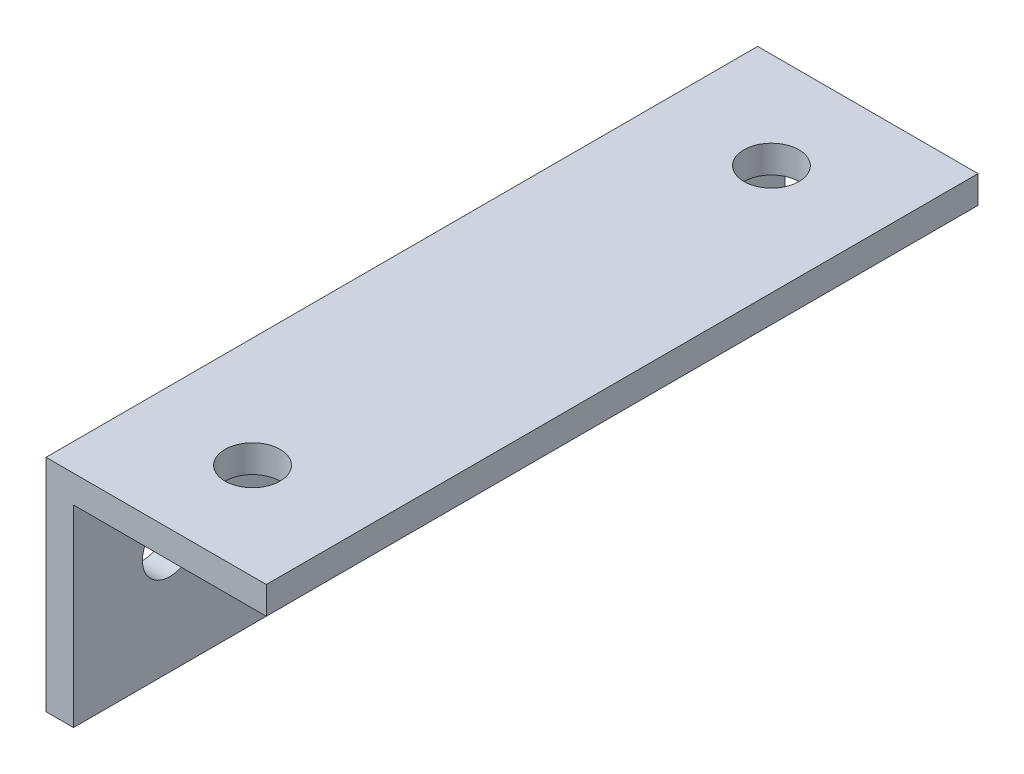
ISO-10303-21;
HEADER;
FILE_DESCRIPTION(('STEP AP214'),'2;1');
FILE_NAME('part.step','',(''),(''),'','','');
FILE_SCHEMA(('AUTOMOTIVE_DESIGN { 1 0 10303 214 1 1 1 1 }'));
ENDSEC;
DATA;
#1=APPLICATION_CONTEXT('core data for automotive mechanical design processes');
#2=APPLICATION_PROTOCOL_DEFINITION('international standard','automotive_design',2000,#1);
#3=PRODUCT_CONTEXT('',#1,'mechanical');
#4=PRODUCT('Part','Part','',(#3));
#5=PRODUCT_RELATED_PRODUCT_CATEGORY('part','',(#4));
#6=PRODUCT_DEFINITION_FORMATION('','',#4);
#7=PRODUCT_DEFINITION_CONTEXT('part definition',#1,'design');
#8=PRODUCT_DEFINITION('design','',#6,#7);
#9=PRODUCT_DEFINITION_SHAPE('','',#8);
#10=(LENGTH_UNIT() NAMED_UNIT(*) SI_UNIT(.MILLI.,.METRE.));
#11=(NAMED_UNIT(*) PLANE_ANGLE_UNIT() SI_UNIT($,.RADIAN.));
#12=(NAMED_UNIT(*) SI_UNIT($,.STERADIAN.) SOLID_ANGLE_UNIT());
#13=UNCERTAINTY_MEASURE_WITH_UNIT(LENGTH_MEASURE(1.E-05),#10,'distance_accuracy_value','');
#14=(GEOMETRIC_REPRESENTATION_CONTEXT(3) GLOBAL_UNCERTAINTY_ASSIGNED_CONTEXT((#13)) GLOBAL_UNIT_ASSIGNED_CONTEXT((#10,
#11,#12)) REPRESENTATION_CONTEXT('',''));
#15=CARTESIAN_POINT('',(0.,0.,0.));
#16=DIRECTION('',(0.,0.,1.));
#17=DIRECTION('',(1.,0.,0.));
#18=AXIS2_PLACEMENT_3D('',#15,#16,#17);
#19=CARTESIAN_POINT('',(3.175,0.,82.042));
#20=DIRECTION('',(0.,1.,0.));
#21=DIRECTION('',(0.,0.,1.));
#22=AXIS2_PLACEMENT_3D('',#19,#20,#21);
#23=PLANE('',#22);
#24=DIRECTION('',(1.,0.,0.));
#25=VECTOR('',#24,1.);
#26=CARTESIAN_POINT('',(3.175,0.,0.));
#27=LINE('',#26,#25);
#28=CARTESIAN_POINT('',(0.,0.,0.));
#29=VERTEX_POINT('',#28);
#30=CARTESIAN_POINT('',(3.175,0.,0.));
#31=VERTEX_POINT('',#30);
#32=EDGE_CURVE('E116',#29,#31,#27,.T.);
#33=ORIENTED_EDGE('',*,*,#32,.T.);
#34=DIRECTION('',(0.,0.,-1.));
#35=VECTOR('',#34,1.);
#36=CARTESIAN_POINT('',(3.175,0.,82.042));
#37=LINE('',#36,#35);
#38=CARTESIAN_POINT('',(3.175,0.,82.042));
#39=VERTEX_POINT('',#38);
#40=EDGE_CURVE('E11',#39,#31,#37,.T.);
#41=ORIENTED_EDGE('',*,*,#40,.F.);
#42=DIRECTION('',(1.,0.,0.));
#43=VECTOR('',#42,1.);
#44=CARTESIAN_POINT('',(3.175,0.,82.042));
#45=LINE('',#44,#43);
#46=CARTESIAN_POINT('',(0.,0.,82.042));
#47=VERTEX_POINT('',#46);
#48=EDGE_CURVE('E127',#47,#39,#45,.T.);
#49=ORIENTED_EDGE('',*,*,#48,.F.);
#50=DIRECTION('',(0.,0.,-1.));
#51=VECTOR('',#50,1.);
#52=CARTESIAN_POINT('',(0.,0.,82.042));
#53=LINE('',#52,#51);
#54=EDGE_CURVE('E112',#47,#29,#53,.T.);
#55=ORIENTED_EDGE('',*,*,#54,.T.);
#56=EDGE_LOOP('',(#33,#41,#49,#55));
#57=FACE_BOUND('',#56,.T.);
#58=ADVANCED_FACE('F32',(#57),#23,.F.);
#59=CARTESIAN_POINT('',(3.175,0.,82.042));
#60=DIRECTION('',(-1.,0.,0.));
#61=DIRECTION('',(0.,0.,1.));
#62=AXIS2_PLACEMENT_3D('',#59,#60,#61);
#63=PLANE('',#62);
#64=CARTESIAN_POINT('',(3.175,12.7,70.9295));
#65=DIRECTION('',(-1.,0.,0.));
#66=DIRECTION('',(0.,0.,1.));
#67=AXIS2_PLACEMENT_3D('',#64,#65,#66);
#68=CIRCLE('',#67,3.175);
#69=CARTESIAN_POINT('',(3.175,12.7,74.1045));
#70=VERTEX_POINT('',#69);
#71=EDGE_CURVE('E261',#70,#70,#68,.T.);
#72=ORIENTED_EDGE('',*,*,#71,.T.);
#73=EDGE_LOOP('',(#72));
#74=FACE_BOUND('',#73,.T.);
#75=CARTESIAN_POINT('',(3.175,12.7,11.1125));
#76=DIRECTION('',(-1.,0.,0.));
#77=DIRECTION('',(0.,0.,1.));
#78=AXIS2_PLACEMENT_3D('',#75,#76,#77);
#79=CIRCLE('',#78,3.175);
#80=CARTESIAN_POINT('',(3.175,12.7,14.2875));
#81=VERTEX_POINT('',#80);
#82=EDGE_CURVE('E120',#81,#81,#79,.T.);
#83=ORIENTED_EDGE('',*,*,#82,.T.);
#84=EDGE_LOOP('',(#83));
#85=FACE_BOUND('',#84,.T.);
#86=DIRECTION('',(0.,1.,0.));
#87=VECTOR('',#86,1.);
#88=CARTESIAN_POINT('',(3.175,0.,0.));
#89=LINE('',#88,#87);
#90=CARTESIAN_POINT('',(3.175,22.225,0.));
#91=VERTEX_POINT('',#90);
#92=EDGE_CURVE('E119',#31,#91,#89,.T.);
#93=ORIENTED_EDGE('',*,*,#92,.T.);
#94=DIRECTION('',(0.,0.,-1.));
#95=VECTOR('',#94,1.);
#96=CARTESIAN_POINT('',(3.175,22.225,82.042));
#97=LINE('',#96,#95);
#98=CARTESIAN_POINT('',(3.175,22.225,82.042));
#99=VERTEX_POINT('',#98);
#100=EDGE_CURVE('E40',#99,#91,#97,.T.);
#101=ORIENTED_EDGE('',*,*,#100,.F.);
#102=DIRECTION('',(0.,1.,0.));
#103=VECTOR('',#102,1.);
#104=CARTESIAN_POINT('',(3.175,0.,82.042));
#105=LINE('',#104,#103);
#106=EDGE_CURVE('E85',#39,#99,#105,.T.);
#107=ORIENTED_EDGE('',*,*,#106,.F.);
#108=ORIENTED_EDGE('',*,*,#40,.T.);
#109=EDGE_LOOP('',(#93,#101,#107,#108));
#110=FACE_BOUND('',#109,.T.);
#111=ADVANCED_FACE('F155',(#74,#85,#110),#63,.F.);
#112=CARTESIAN_POINT('',(3.175,22.225,82.042));
#113=DIRECTION('',(0.,1.,0.));
#114=DIRECTION('',(0.,0.,1.));
#115=AXIS2_PLACEMENT_3D('',#112,#113,#114);
#116=PLANE('',#115);
#117=CARTESIAN_POINT('',(12.7,22.225,11.1125));
#118=DIRECTION('',(0.,1.,0.));
#119=DIRECTION('',(0.,0.,1.));
#120=AXIS2_PLACEMENT_3D('',#117,#118,#119);
#121=CIRCLE('',#120,3.175);
#122=CARTESIAN_POINT('',(12.7,22.225,14.2875));
#123=VERTEX_POINT('',#122);
#124=EDGE_CURVE('E276',#123,#123,#121,.T.);
#125=ORIENTED_EDGE('',*,*,#124,.T.);
#126=EDGE_LOOP('',(#125));
#127=FACE_BOUND('',#126,.T.);
#128=CARTESIAN_POINT('',(12.7,22.225,70.9295));
#129=DIRECTION('',(0.,1.,0.));
#130=DIRECTION('',(0.,0.,1.));
#131=AXIS2_PLACEMENT_3D('',#128,#129,#130);
#132=CIRCLE('',#131,3.175);
#133=CARTESIAN_POINT('',(12.7,22.225,74.1045));
#134=VERTEX_POINT('',#133);
#135=EDGE_CURVE('E270',#134,#134,#132,.T.);
#136=ORIENTED_EDGE('',*,*,#135,.T.);
#137=EDGE_LOOP('',(#136));
#138=FACE_BOUND('',#137,.T.);
#139=DIRECTION('',(1.,0.,0.));
#140=VECTOR('',#139,1.);
#141=CARTESIAN_POINT('',(3.175,22.225,0.));
#142=LINE('',#141,#140);
#143=CARTESIAN_POINT('',(25.4,22.225,0.));
#144=VERTEX_POINT('',#143);
#145=EDGE_CURVE('E122',#91,#144,#142,.T.);
#146=ORIENTED_EDGE('',*,*,#145,.T.);
#147=DIRECTION('',(0.,0.,-1.));
#148=VECTOR('',#147,1.);
#149=CARTESIAN_POINT('',(25.4,22.225,82.042));
#150=LINE('',#149,#148);
#151=CARTESIAN_POINT('',(25.4,22.225,82.042));
#152=VERTEX_POINT('',#151);
#153=EDGE_CURVE('E107',#152,#144,#150,.T.);
#154=ORIENTED_EDGE('',*,*,#153,.F.);
#155=DIRECTION('',(1.,0.,0.));
#156=VECTOR('',#155,1.);
#157=CARTESIAN_POINT('',(3.175,22.225,82.042));
#158=LINE('',#157,#156);
#159=EDGE_CURVE('E98',#99,#152,#158,.T.);
#160=ORIENTED_EDGE('',*,*,#159,.F.);
#161=ORIENTED_EDGE('',*,*,#100,.T.);
#162=EDGE_LOOP('',(#146,#154,#160,#161));
#163=FACE_BOUND('',#162,.T.);
#164=ADVANCED_FACE('F133',(#127,#138,#163),#116,.F.);
#165=CARTESIAN_POINT('',(25.4,22.225,82.042));
#166=DIRECTION('',(-1.,0.,0.));
#167=DIRECTION('',(0.,0.,1.));
#168=AXIS2_PLACEMENT_3D('',#165,#166,#167);
#169=PLANE('',#168);
#170=DIRECTION('',(0.,1.,0.));
#171=VECTOR('',#170,1.);
#172=CARTESIAN_POINT('',(25.4,22.225,0.));
#173=LINE('',#172,#171);
#174=CARTESIAN_POINT('',(25.4,25.4,0.));
#175=VERTEX_POINT('',#174);
#176=EDGE_CURVE('E106',#144,#175,#173,.T.);
#177=ORIENTED_EDGE('',*,*,#176,.T.);
#178=DIRECTION('',(0.,0.,-1.));
#179=VECTOR('',#178,1.);
#180=CARTESIAN_POINT('',(25.4,25.4,82.042));
#181=LINE('',#180,#179);
#182=CARTESIAN_POINT('',(25.4,25.4,82.042));
#183=VERTEX_POINT('',#182);
#184=EDGE_CURVE('E103',#183,#175,#181,.T.);
#185=ORIENTED_EDGE('',*,*,#184,.F.);
#186=DIRECTION('',(0.,1.,0.));
#187=VECTOR('',#186,1.);
#188=CARTESIAN_POINT('',(25.4,22.225,82.042));
#189=LINE('',#188,#187);
#190=EDGE_CURVE('E92',#152,#183,#189,.T.);
#191=ORIENTED_EDGE('',*,*,#190,.F.);
#192=ORIENTED_EDGE('',*,*,#153,.T.);
#193=EDGE_LOOP('',(#177,#185,#191,#192));
#194=FACE_BOUND('',#193,.T.);
#195=ADVANCED_FACE('F104',(#194),#169,.F.);
#196=CARTESIAN_POINT('',(0.,25.4,82.042));
#197=DIRECTION('',(0.,-1.,0.));
#198=DIRECTION('',(0.,0.,-1.));
#199=AXIS2_PLACEMENT_3D('',#196,#197,#198);
#200=PLANE('',#199);
#201=CARTESIAN_POINT('',(12.7,25.4,11.1125));
#202=DIRECTION('',(0.,1.,0.));
#203=DIRECTION('',(0.,0.,1.));
#204=AXIS2_PLACEMENT_3D('',#201,#202,#203);
#205=CIRCLE('',#204,3.175);
#206=CARTESIAN_POINT('',(12.7,25.4,14.2875));
#207=VERTEX_POINT('',#206);
#208=EDGE_CURVE('E279',#207,#207,#205,.T.);
#209=ORIENTED_EDGE('',*,*,#208,.F.);
#210=EDGE_LOOP('',(#209));
#211=FACE_BOUND('',#210,.T.);
#212=CARTESIAN_POINT('',(12.7,25.4,70.9295));
#213=DIRECTION('',(0.,1.,0.));
#214=DIRECTION('',(0.,0.,-1.));
#215=AXIS2_PLACEMENT_3D('',#212,#213,#214);
#216=CIRCLE('',#215,3.175);
#217=CARTESIAN_POINT('',(12.7,25.4,67.7545));
#218=VERTEX_POINT('',#217);
#219=EDGE_CURVE('E273',#218,#218,#216,.T.);
#220=ORIENTED_EDGE('',*,*,#219,.F.);
#221=EDGE_LOOP('',(#220));
#222=FACE_BOUND('',#221,.T.);
#223=DIRECTION('',(-1.,0.,0.));
#224=VECTOR('',#223,1.);
#225=CARTESIAN_POINT('',(0.,25.4,0.));
#226=LINE('',#225,#224);
#227=CARTESIAN_POINT('',(0.,25.4,0.));
#228=VERTEX_POINT('',#227);
#229=EDGE_CURVE('E71',#175,#228,#226,.T.);
#230=ORIENTED_EDGE('',*,*,#229,.T.);
#231=DIRECTION('',(0.,0.,-1.));
#232=VECTOR('',#231,1.);
#233=CARTESIAN_POINT('',(0.,25.4,82.042));
#234=LINE('',#233,#232);
#235=CARTESIAN_POINT('',(0.,25.4,82.042));
#236=VERTEX_POINT('',#235);
#237=EDGE_CURVE('E108',#236,#228,#234,.T.);
#238=ORIENTED_EDGE('',*,*,#237,.F.);
#239=DIRECTION('',(-1.,0.,0.));
#240=VECTOR('',#239,1.);
#241=CARTESIAN_POINT('',(0.,25.4,82.042));
#242=LINE('',#241,#240);
#243=EDGE_CURVE('E96',#183,#236,#242,.T.);
#244=ORIENTED_EDGE('',*,*,#243,.F.);
#245=ORIENTED_EDGE('',*,*,#184,.T.);
#246=EDGE_LOOP('',(#230,#238,#244,#245));
#247=FACE_BOUND('',#246,.T.);
#248=ADVANCED_FACE('F110',(#211,#222,#247),#200,.F.);
#249=CARTESIAN_POINT('',(0.,0.,82.042));
#250=DIRECTION('',(1.,0.,0.));
#251=DIRECTION('',(0.,0.,-1.));
#252=AXIS2_PLACEMENT_3D('',#249,#250,#251);
#253=PLANE('',#252);
#254=CARTESIAN_POINT('',(0.,12.7,70.9295));
#255=DIRECTION('',(-1.,0.,0.));
#256=DIRECTION('',(0.,0.,1.));
#257=AXIS2_PLACEMENT_3D('',#254,#255,#256);
#258=CIRCLE('',#257,3.175);
#259=CARTESIAN_POINT('',(0.,12.7,74.1045));
#260=VERTEX_POINT('',#259);
#261=EDGE_CURVE('E267',#260,#260,#258,.T.);
#262=ORIENTED_EDGE('',*,*,#261,.F.);
#263=EDGE_LOOP('',(#262));
#264=FACE_BOUND('',#263,.T.);
#265=CARTESIAN_POINT('',(0.,12.7,11.1125));
#266=DIRECTION('',(-1.,0.,0.));
#267=DIRECTION('',(0.,0.,-1.));
#268=AXIS2_PLACEMENT_3D('',#265,#266,#267);
#269=CIRCLE('',#268,3.175);
#270=CARTESIAN_POINT('',(0.,12.7,7.9375));
#271=VERTEX_POINT('',#270);
#272=EDGE_CURVE('E257',#271,#271,#269,.T.);
#273=ORIENTED_EDGE('',*,*,#272,.F.);
#274=EDGE_LOOP('',(#273));
#275=FACE_BOUND('',#274,.T.);
#276=DIRECTION('',(0.,-1.,0.));
#277=VECTOR('',#276,1.);
#278=CARTESIAN_POINT('',(0.,0.,0.));
#279=LINE('',#278,#277);
#280=EDGE_CURVE('E77',#228,#29,#279,.T.);
#281=ORIENTED_EDGE('',*,*,#280,.T.);
#282=ORIENTED_EDGE('',*,*,#54,.F.);
#283=DIRECTION('',(0.,-1.,0.));
#284=VECTOR('',#283,1.);
#285=CARTESIAN_POINT('',(0.,0.,82.042));
#286=LINE('',#285,#284);
#287=EDGE_CURVE('E48',#236,#47,#286,.T.);
#288=ORIENTED_EDGE('',*,*,#287,.F.);
#289=ORIENTED_EDGE('',*,*,#237,.T.);
#290=EDGE_LOOP('',(#281,#282,#288,#289));
#291=FACE_BOUND('',#290,.T.);
#292=ADVANCED_FACE('F140',(#264,#275,#291),#253,.F.);
#293=CARTESIAN_POINT('',(0.,0.,82.042));
#294=DIRECTION('',(0.,0.,-1.));
#295=DIRECTION('',(-1.,0.,0.));
#296=AXIS2_PLACEMENT_3D('',#293,#294,#295);
#297=PLANE('',#296);
#298=ORIENTED_EDGE('',*,*,#48,.T.);
#299=ORIENTED_EDGE('',*,*,#106,.T.);
#300=ORIENTED_EDGE('',*,*,#159,.T.);
#301=ORIENTED_EDGE('',*,*,#190,.T.);
#302=ORIENTED_EDGE('',*,*,#243,.T.);
#303=ORIENTED_EDGE('',*,*,#287,.T.);
#304=EDGE_LOOP('',(#298,#299,#300,#301,#302,#303));
#305=FACE_BOUND('',#304,.T.);
#306=ADVANCED_FACE('F94',(#305),#297,.F.);
#307=CARTESIAN_POINT('',(0.,0.,0.));
#308=DIRECTION('',(0.,0.,-1.));
#309=DIRECTION('',(-1.,0.,0.));
#310=AXIS2_PLACEMENT_3D('',#307,#308,#309);
#311=PLANE('',#310);
#312=ORIENTED_EDGE('',*,*,#32,.F.);
#313=ORIENTED_EDGE('',*,*,#280,.F.);
#314=ORIENTED_EDGE('',*,*,#229,.F.);
#315=ORIENTED_EDGE('',*,*,#176,.F.);
#316=ORIENTED_EDGE('',*,*,#145,.F.);
#317=ORIENTED_EDGE('',*,*,#92,.F.);
#318=EDGE_LOOP('',(#312,#313,#314,#315,#316,#317));
#319=FACE_BOUND('',#318,.T.);
#320=ADVANCED_FACE('F136',(#319),#311,.T.);
#321=CARTESIAN_POINT('',(82.042,12.7,11.1125));
#322=DIRECTION('',(-1.,0.,0.));
#323=DIRECTION('',(0.,0.,1.));
#324=AXIS2_PLACEMENT_3D('',#321,#322,#323);
#325=CYLINDRICAL_SURFACE('',#324,3.175);
#326=ORIENTED_EDGE('',*,*,#272,.T.);
#327=EDGE_LOOP('',(#326));
#328=FACE_BOUND('',#327,.T.);
#329=ORIENTED_EDGE('',*,*,#82,.F.);
#330=EDGE_LOOP('',(#329));
#331=FACE_BOUND('',#330,.T.);
#332=ADVANCED_FACE('F213',(#328,#331),#325,.F.);
#333=CARTESIAN_POINT('',(82.042,12.7,70.9295));
#334=DIRECTION('',(-1.,0.,0.));
#335=DIRECTION('',(0.,0.,1.));
#336=AXIS2_PLACEMENT_3D('',#333,#334,#335);
#337=CYLINDRICAL_SURFACE('',#336,3.175);
#338=ORIENTED_EDGE('',*,*,#261,.T.);
#339=EDGE_LOOP('',(#338));
#340=FACE_BOUND('',#339,.T.);
#341=ORIENTED_EDGE('',*,*,#71,.F.);
#342=EDGE_LOOP('',(#341));
#343=FACE_BOUND('',#342,.T.);
#344=ADVANCED_FACE('F193',(#340,#343),#337,.F.);
#345=CARTESIAN_POINT('',(12.7,-56.642,70.9295));
#346=DIRECTION('',(0.,1.,0.));
#347=DIRECTION('',(0.,0.,1.));
#348=AXIS2_PLACEMENT_3D('',#345,#346,#347);
#349=CYLINDRICAL_SURFACE('',#348,3.175);
#350=ORIENTED_EDGE('',*,*,#219,.T.);
#351=EDGE_LOOP('',(#350));
#352=FACE_BOUND('',#351,.T.);
#353=ORIENTED_EDGE('',*,*,#135,.F.);
#354=EDGE_LOOP('',(#353));
#355=FACE_BOUND('',#354,.T.);
#356=ADVANCED_FACE('F187',(#352,#355),#349,.F.);
#357=CARTESIAN_POINT('',(12.7,-56.642,11.1125));
#358=DIRECTION('',(0.,1.,0.));
#359=DIRECTION('',(0.,0.,1.));
#360=AXIS2_PLACEMENT_3D('',#357,#358,#359);
#361=CYLINDRICAL_SURFACE('',#360,3.175);
#362=ORIENTED_EDGE('',*,*,#208,.T.);
#363=EDGE_LOOP('',(#362));
#364=FACE_BOUND('',#363,.T.);
#365=ORIENTED_EDGE('',*,*,#124,.F.);
#366=EDGE_LOOP('',(#365));
#367=FACE_BOUND('',#366,.T.);
#368=ADVANCED_FACE('F192',(#364,#367),#361,.F.);
#369=CLOSED_SHELL('',(#58,#111,#164,#195,#248,#292,#306,#320,#332,#344,#356,#368));
#370=MANIFOLD_SOLID_BREP('B2',#369);
#371=ADVANCED_BREP_SHAPE_REPRESENTATION('',(#18,#370),#14);
#372=SHAPE_DEFINITION_REPRESENTATION(#9,#371);
ENDSEC;
END-ISO-10303-21;
